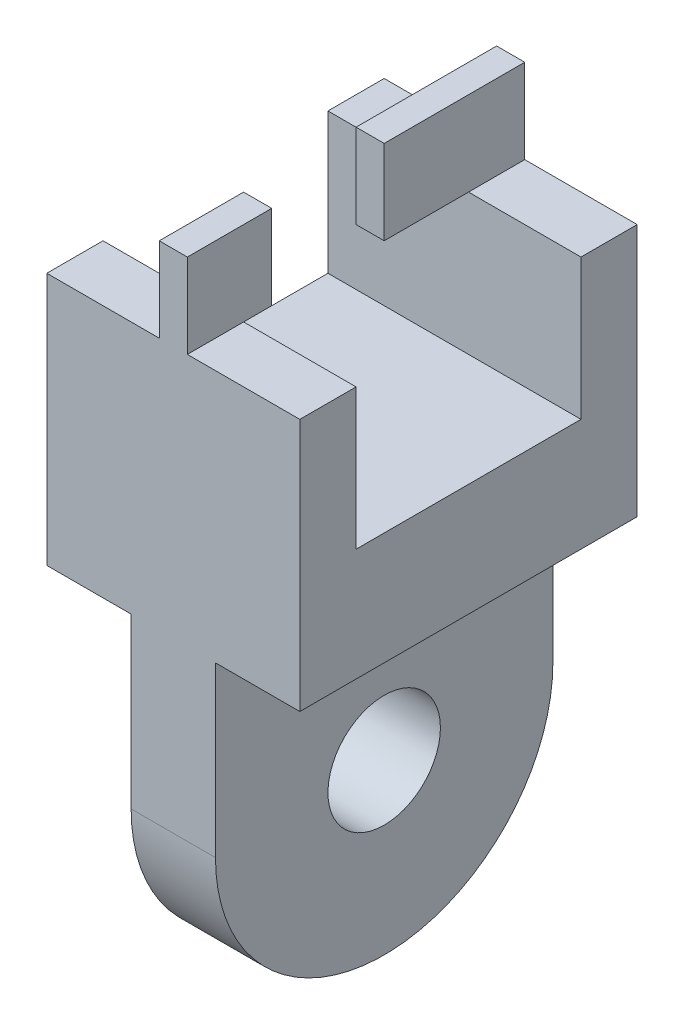
ISO-10303-21;
HEADER;
FILE_DESCRIPTION(('STEP AP214'),'2;1');
FILE_NAME('part.step','',(''),(''),'','','');
FILE_SCHEMA(('AUTOMOTIVE_DESIGN { 1 0 10303 214 1 1 1 1 }'));
ENDSEC;
DATA;
#1=APPLICATION_CONTEXT('core data for automotive mechanical design processes');
#2=APPLICATION_PROTOCOL_DEFINITION('international standard','automotive_design',2000,#1);
#3=PRODUCT_CONTEXT('',#1,'mechanical');
#4=PRODUCT('Part','Part','',(#3));
#5=PRODUCT_RELATED_PRODUCT_CATEGORY('part','',(#4));
#6=PRODUCT_DEFINITION_FORMATION('','',#4);
#7=PRODUCT_DEFINITION_CONTEXT('part definition',#1,'design');
#8=PRODUCT_DEFINITION('design','',#6,#7);
#9=PRODUCT_DEFINITION_SHAPE('','',#8);
#10=(LENGTH_UNIT() NAMED_UNIT(*) SI_UNIT(.MILLI.,.METRE.));
#11=(NAMED_UNIT(*) PLANE_ANGLE_UNIT() SI_UNIT($,.RADIAN.));
#12=(NAMED_UNIT(*) SI_UNIT($,.STERADIAN.) SOLID_ANGLE_UNIT());
#13=UNCERTAINTY_MEASURE_WITH_UNIT(LENGTH_MEASURE(1.E-05),#10,'distance_accuracy_value','');
#14=(GEOMETRIC_REPRESENTATION_CONTEXT(3) GLOBAL_UNCERTAINTY_ASSIGNED_CONTEXT((#13)) GLOBAL_UNIT_ASSIGNED_CONTEXT((#10,
#11,#12)) REPRESENTATION_CONTEXT('',''));
#15=CARTESIAN_POINT('',(0.,0.,0.));
#16=DIRECTION('',(0.,0.,1.));
#17=DIRECTION('',(1.,0.,0.));
#18=AXIS2_PLACEMENT_3D('',#15,#16,#17);
#19=CARTESIAN_POINT('',(112.5,0.,0.));
#20=DIRECTION('',(1.,0.,0.));
#21=DIRECTION('',(0.,0.,-1.));
#22=AXIS2_PLACEMENT_3D('',#19,#20,#21);
#23=PLANE('',#22);
#24=DIRECTION('',(0.,0.,1.));
#25=VECTOR('',#24,1.);
#26=CARTESIAN_POINT('',(112.5,375.,-150.));
#27=LINE('',#26,#25);
#28=CARTESIAN_POINT('',(112.5,375.,100.));
#29=VERTEX_POINT('',#28);
#30=CARTESIAN_POINT('',(112.5,375.,150.));
#31=VERTEX_POINT('',#30);
#32=EDGE_CURVE('E292',#29,#31,#27,.T.);
#33=ORIENTED_EDGE('',*,*,#32,.T.);
#34=DIRECTION('',(0.,1.,0.));
#35=VECTOR('',#34,1.);
#36=CARTESIAN_POINT('',(112.5,0.,150.));
#37=LINE('',#36,#35);
#38=CARTESIAN_POINT('',(112.5,150.,150.));
#39=VERTEX_POINT('',#38);
#40=EDGE_CURVE('E356',#39,#31,#37,.T.);
#41=ORIENTED_EDGE('',*,*,#40,.F.);
#42=DIRECTION('',(0.,0.,1.));
#43=VECTOR('',#42,1.);
#44=CARTESIAN_POINT('',(112.5,150.,-150.));
#45=LINE('',#44,#43);
#46=CARTESIAN_POINT('',(112.5,150.,-150.));
#47=VERTEX_POINT('',#46);
#48=EDGE_CURVE('E312',#47,#39,#45,.T.);
#49=ORIENTED_EDGE('',*,*,#48,.F.);
#50=DIRECTION('',(0.,-1.,0.));
#51=VECTOR('',#50,1.);
#52=CARTESIAN_POINT('',(112.5,450.,-150.));
#53=LINE('',#52,#51);
#54=CARTESIAN_POINT('',(112.5,375.,-150.));
#55=VERTEX_POINT('',#54);
#56=EDGE_CURVE('E353',#55,#47,#53,.T.);
#57=ORIENTED_EDGE('',*,*,#56,.F.);
#58=CARTESIAN_POINT('',(112.5,375.,-100.));
#59=VERTEX_POINT('',#58);
#60=EDGE_CURVE('E288',#55,#59,#27,.T.);
#61=ORIENTED_EDGE('',*,*,#60,.T.);
#62=DIRECTION('',(0.,1.,0.));
#63=VECTOR('',#62,1.);
#64=CARTESIAN_POINT('',(112.5,250.,-100.));
#65=LINE('',#64,#63);
#66=CARTESIAN_POINT('',(112.5,250.,-100.));
#67=VERTEX_POINT('',#66);
#68=EDGE_CURVE('E365',#67,#59,#65,.T.);
#69=ORIENTED_EDGE('',*,*,#68,.F.);
#70=DIRECTION('',(0.,0.,-1.));
#71=VECTOR('',#70,1.);
#72=CARTESIAN_POINT('',(112.5,250.,100.));
#73=LINE('',#72,#71);
#74=CARTESIAN_POINT('',(112.5,250.,100.));
#75=VERTEX_POINT('',#74);
#76=EDGE_CURVE('E362',#75,#67,#73,.T.);
#77=ORIENTED_EDGE('',*,*,#76,.F.);
#78=DIRECTION('',(0.,-1.,0.));
#79=VECTOR('',#78,1.);
#80=CARTESIAN_POINT('',(112.5,375.,100.));
#81=LINE('',#80,#79);
#82=EDGE_CURVE('E359',#29,#75,#81,.T.);
#83=ORIENTED_EDGE('',*,*,#82,.F.);
#84=EDGE_LOOP('',(#33,#41,#49,#57,#61,#69,#77,#83));
#85=FACE_BOUND('',#84,.T.);
#86=ADVANCED_FACE('F82',(#85),#23,.T.);
#87=CARTESIAN_POINT('',(112.5,450.,-24.9999999999999));
#88=DIRECTION('',(0.,1.,0.));
#89=DIRECTION('',(0.,0.,1.));
#90=AXIS2_PLACEMENT_3D('',#87,#88,#89);
#91=PLANE('',#90);
#92=DIRECTION('',(0.,0.,1.));
#93=VECTOR('',#92,1.);
#94=CARTESIAN_POINT('',(12.5,450.,-150.));
#95=LINE('',#94,#93);
#96=CARTESIAN_POINT('',(12.5,450.,-150.));
#97=VERTEX_POINT('',#96);
#98=CARTESIAN_POINT('',(12.5,450.,-24.9999999999999));
#99=VERTEX_POINT('',#98);
#100=EDGE_CURVE('E296',#97,#99,#95,.T.);
#101=ORIENTED_EDGE('',*,*,#100,.F.);
#102=DIRECTION('',(-1.,0.,0.));
#103=VECTOR('',#102,1.);
#104=CARTESIAN_POINT('',(112.5,450.,-150.));
#105=LINE('',#104,#103);
#106=CARTESIAN_POINT('',(-12.5,450.,-150.));
#107=VERTEX_POINT('',#106);
#108=EDGE_CURVE('E368',#97,#107,#105,.T.);
#109=ORIENTED_EDGE('',*,*,#108,.T.);
#110=DIRECTION('',(0.,0.,1.));
#111=VECTOR('',#110,1.);
#112=CARTESIAN_POINT('',(-12.5,450.,-150.));
#113=LINE('',#112,#111);
#114=CARTESIAN_POINT('',(-12.5,450.,-24.9999999999999));
#115=VERTEX_POINT('',#114);
#116=EDGE_CURVE('E268',#107,#115,#113,.T.);
#117=ORIENTED_EDGE('',*,*,#116,.T.);
#118=DIRECTION('',(-1.,0.,0.));
#119=VECTOR('',#118,1.);
#120=CARTESIAN_POINT('',(112.5,450.,-24.9999999999999));
#121=LINE('',#120,#119);
#122=EDGE_CURVE('E91',#99,#115,#121,.T.);
#123=ORIENTED_EDGE('',*,*,#122,.F.);
#124=EDGE_LOOP('',(#101,#109,#117,#123));
#125=FACE_BOUND('',#124,.T.);
#126=ADVANCED_FACE('F84',(#125),#91,.T.);
#127=CARTESIAN_POINT('',(112.5,375.,-24.9999999999999));
#128=DIRECTION('',(0.,0.,1.));
#129=DIRECTION('',(0.,-1.,0.));
#130=AXIS2_PLACEMENT_3D('',#127,#128,#129);
#131=PLANE('',#130);
#132=DIRECTION('',(0.,-1.,0.));
#133=VECTOR('',#132,1.);
#134=CARTESIAN_POINT('',(12.5,375.,-24.9999999999999));
#135=LINE('',#134,#133);
#136=CARTESIAN_POINT('',(12.5,375.,-24.9999999999999));
#137=VERTEX_POINT('',#136);
#138=EDGE_CURVE('E338',#99,#137,#135,.T.);
#139=ORIENTED_EDGE('',*,*,#138,.F.);
#140=ORIENTED_EDGE('',*,*,#122,.T.);
#141=DIRECTION('',(0.,-1.,0.));
#142=VECTOR('',#141,1.);
#143=CARTESIAN_POINT('',(-12.5,375.,-24.9999999999999));
#144=LINE('',#143,#142);
#145=CARTESIAN_POINT('',(-12.5,375.,-24.9999999999999));
#146=VERTEX_POINT('',#145);
#147=EDGE_CURVE('E333',#115,#146,#144,.T.);
#148=ORIENTED_EDGE('',*,*,#147,.T.);
#149=DIRECTION('',(-1.,0.,0.));
#150=VECTOR('',#149,1.);
#151=CARTESIAN_POINT('',(112.5,375.,-24.9999999999999));
#152=LINE('',#151,#150);
#153=EDGE_CURVE('E371',#137,#146,#152,.T.);
#154=ORIENTED_EDGE('',*,*,#153,.F.);
#155=EDGE_LOOP('',(#139,#140,#148,#154));
#156=FACE_BOUND('',#155,.T.);
#157=ADVANCED_FACE('F485',(#156),#131,.T.);
#158=CARTESIAN_POINT('',(112.5,375.,-100.));
#159=DIRECTION('',(0.,-1.,0.));
#160=DIRECTION('',(0.,0.,-1.));
#161=AXIS2_PLACEMENT_3D('',#158,#159,#160);
#162=PLANE('',#161);
#163=DIRECTION('',(0.,0.,1.));
#164=VECTOR('',#163,1.);
#165=CARTESIAN_POINT('',(12.5,375.,-150.));
#166=LINE('',#165,#164);
#167=CARTESIAN_POINT('',(12.5,375.,-100.));
#168=VERTEX_POINT('',#167);
#169=EDGE_CURVE('E295',#168,#137,#166,.T.);
#170=ORIENTED_EDGE('',*,*,#169,.T.);
#171=ORIENTED_EDGE('',*,*,#153,.T.);
#172=DIRECTION('',(0.,0.,1.));
#173=VECTOR('',#172,1.);
#174=CARTESIAN_POINT('',(-12.5,375.,-150.));
#175=LINE('',#174,#173);
#176=CARTESIAN_POINT('',(-12.5,375.,-100.));
#177=VERTEX_POINT('',#176);
#178=EDGE_CURVE('E277',#177,#146,#175,.T.);
#179=ORIENTED_EDGE('',*,*,#178,.F.);
#180=DIRECTION('',(-1.,0.,0.));
#181=VECTOR('',#180,1.);
#182=CARTESIAN_POINT('',(112.5,375.,-100.));
#183=LINE('',#182,#181);
#184=EDGE_CURVE('E377',#168,#177,#183,.T.);
#185=ORIENTED_EDGE('',*,*,#184,.F.);
#186=EDGE_LOOP('',(#170,#171,#179,#185));
#187=FACE_BOUND('',#186,.T.);
#188=ADVANCED_FACE('F435',(#187),#162,.T.);
#189=CARTESIAN_POINT('',(112.5,375.,75.));
#190=DIRECTION('',(0.,-1.,0.));
#191=DIRECTION('',(0.,0.,-1.));
#192=AXIS2_PLACEMENT_3D('',#189,#190,#191);
#193=PLANE('',#192);
#194=CARTESIAN_POINT('',(12.5,375.,75.));
#195=VERTEX_POINT('',#194);
#196=CARTESIAN_POINT('',(12.5,375.,100.));
#197=VERTEX_POINT('',#196);
#198=EDGE_CURVE('E459',#195,#197,#166,.T.);
#199=ORIENTED_EDGE('',*,*,#198,.T.);
#200=DIRECTION('',(-1.,0.,0.));
#201=VECTOR('',#200,1.);
#202=CARTESIAN_POINT('',(112.5,375.,100.));
#203=LINE('',#202,#201);
#204=CARTESIAN_POINT('',(-12.5,375.,100.));
#205=VERTEX_POINT('',#204);
#206=EDGE_CURVE('E384',#197,#205,#203,.T.);
#207=ORIENTED_EDGE('',*,*,#206,.T.);
#208=CARTESIAN_POINT('',(-12.5,375.,75.));
#209=VERTEX_POINT('',#208);
#210=EDGE_CURVE('E438',#209,#205,#175,.T.);
#211=ORIENTED_EDGE('',*,*,#210,.F.);
#212=DIRECTION('',(-1.,0.,0.));
#213=VECTOR('',#212,1.);
#214=CARTESIAN_POINT('',(112.5,375.,75.));
#215=LINE('',#214,#213);
#216=EDGE_CURVE('E385',#195,#209,#215,.T.);
#217=ORIENTED_EDGE('',*,*,#216,.F.);
#218=EDGE_LOOP('',(#199,#207,#211,#217));
#219=FACE_BOUND('',#218,.T.);
#220=ADVANCED_FACE('F457',(#219),#193,.T.);
#221=CARTESIAN_POINT('',(112.5,450.,75.));
#222=DIRECTION('',(0.,0.,-1.));
#223=DIRECTION('',(0.,1.,0.));
#224=AXIS2_PLACEMENT_3D('',#221,#222,#223);
#225=PLANE('',#224);
#226=DIRECTION('',(0.,1.,0.));
#227=VECTOR('',#226,1.);
#228=CARTESIAN_POINT('',(12.5,450.,75.));
#229=LINE('',#228,#227);
#230=CARTESIAN_POINT('',(12.5,450.,75.));
#231=VERTEX_POINT('',#230);
#232=EDGE_CURVE('E336',#195,#231,#229,.T.);
#233=ORIENTED_EDGE('',*,*,#232,.F.);
#234=ORIENTED_EDGE('',*,*,#216,.T.);
#235=DIRECTION('',(0.,1.,0.));
#236=VECTOR('',#235,1.);
#237=CARTESIAN_POINT('',(-12.5,450.,75.));
#238=LINE('',#237,#236);
#239=CARTESIAN_POINT('',(-12.5,450.,75.));
#240=VERTEX_POINT('',#239);
#241=EDGE_CURVE('E330',#209,#240,#238,.T.);
#242=ORIENTED_EDGE('',*,*,#241,.T.);
#243=DIRECTION('',(-1.,0.,0.));
#244=VECTOR('',#243,1.);
#245=CARTESIAN_POINT('',(112.5,450.,75.));
#246=LINE('',#245,#244);
#247=EDGE_CURVE('E388',#231,#240,#246,.T.);
#248=ORIENTED_EDGE('',*,*,#247,.F.);
#249=EDGE_LOOP('',(#233,#234,#242,#248));
#250=FACE_BOUND('',#249,.T.);
#251=ADVANCED_FACE('F453',(#250),#225,.T.);
#252=CARTESIAN_POINT('',(112.5,450.,150.));
#253=DIRECTION('',(0.,1.,0.));
#254=DIRECTION('',(0.,0.,1.));
#255=AXIS2_PLACEMENT_3D('',#252,#253,#254);
#256=PLANE('',#255);
#257=CARTESIAN_POINT('',(12.5,450.,150.));
#258=VERTEX_POINT('',#257);
#259=EDGE_CURVE('E99',#231,#258,#95,.T.);
#260=ORIENTED_EDGE('',*,*,#259,.F.);
#261=ORIENTED_EDGE('',*,*,#247,.T.);
#262=CARTESIAN_POINT('',(-12.5,450.,150.));
#263=VERTEX_POINT('',#262);
#264=EDGE_CURVE('E272',#240,#263,#113,.T.);
#265=ORIENTED_EDGE('',*,*,#264,.T.);
#266=DIRECTION('',(-1.,0.,0.));
#267=VECTOR('',#266,1.);
#268=CARTESIAN_POINT('',(112.5,450.,150.));
#269=LINE('',#268,#267);
#270=EDGE_CURVE('E391',#258,#263,#269,.T.);
#271=ORIENTED_EDGE('',*,*,#270,.F.);
#272=EDGE_LOOP('',(#260,#261,#265,#271));
#273=FACE_BOUND('',#272,.T.);
#274=ADVANCED_FACE('F449',(#273),#256,.T.);
#275=CARTESIAN_POINT('',(112.5,0.,150.));
#276=DIRECTION('',(0.,0.,1.));
#277=DIRECTION('',(1.,0.,0.));
#278=AXIS2_PLACEMENT_3D('',#275,#276,#277);
#279=PLANE('',#278);
#280=DIRECTION('',(1.,0.,0.));
#281=VECTOR('',#280,1.);
#282=CARTESIAN_POINT('',(12.5,375.,150.));
#283=LINE('',#282,#281);
#284=CARTESIAN_POINT('',(12.5,375.,150.));
#285=VERTEX_POINT('',#284);
#286=EDGE_CURVE('E301',#285,#31,#283,.T.);
#287=ORIENTED_EDGE('',*,*,#286,.F.);
#288=DIRECTION('',(0.,-1.,0.));
#289=VECTOR('',#288,1.);
#290=CARTESIAN_POINT('',(12.5,450.,150.));
#291=LINE('',#290,#289);
#292=EDGE_CURVE('E299',#258,#285,#291,.T.);
#293=ORIENTED_EDGE('',*,*,#292,.F.);
#294=ORIENTED_EDGE('',*,*,#270,.T.);
#295=DIRECTION('',(0.,-1.,0.));
#296=VECTOR('',#295,1.);
#297=CARTESIAN_POINT('',(-12.5,450.,150.));
#298=LINE('',#297,#296);
#299=CARTESIAN_POINT('',(-12.5,375.,150.));
#300=VERTEX_POINT('',#299);
#301=EDGE_CURVE('E282',#263,#300,#298,.T.);
#302=ORIENTED_EDGE('',*,*,#301,.T.);
#303=DIRECTION('',(-1.,0.,0.));
#304=VECTOR('',#303,1.);
#305=CARTESIAN_POINT('',(-12.5,375.,150.));
#306=LINE('',#305,#304);
#307=CARTESIAN_POINT('',(-112.5,375.,150.));
#308=VERTEX_POINT('',#307);
#309=EDGE_CURVE('E280',#300,#308,#306,.T.);
#310=ORIENTED_EDGE('',*,*,#309,.T.);
#311=DIRECTION('',(0.,1.,0.));
#312=VECTOR('',#311,1.);
#313=CARTESIAN_POINT('',(-112.5,0.,150.));
#314=LINE('',#313,#312);
#315=CARTESIAN_POINT('',(-112.5,150.,150.));
#316=VERTEX_POINT('',#315);
#317=EDGE_CURVE('E261',#316,#308,#314,.T.);
#318=ORIENTED_EDGE('',*,*,#317,.F.);
#319=DIRECTION('',(1.,0.,0.));
#320=VECTOR('',#319,1.);
#321=CARTESIAN_POINT('',(-112.5,150.,150.));
#322=LINE('',#321,#320);
#323=CARTESIAN_POINT('',(-37.5,150.,150.));
#324=VERTEX_POINT('',#323);
#325=EDGE_CURVE('E238',#316,#324,#322,.T.);
#326=ORIENTED_EDGE('',*,*,#325,.T.);
#327=DIRECTION('',(0.,-1.,0.));
#328=VECTOR('',#327,1.);
#329=CARTESIAN_POINT('',(-37.5,150.,150.));
#330=LINE('',#329,#328);
#331=CARTESIAN_POINT('',(-37.5,0.,150.));
#332=VERTEX_POINT('',#331);
#333=EDGE_CURVE('E248',#324,#332,#330,.T.);
#334=ORIENTED_EDGE('',*,*,#333,.T.);
#335=DIRECTION('',(-1.,0.,0.));
#336=VECTOR('',#335,1.);
#337=CARTESIAN_POINT('',(112.5,0.,150.));
#338=LINE('',#337,#336);
#339=CARTESIAN_POINT('',(37.5,0.,150.));
#340=VERTEX_POINT('',#339);
#341=EDGE_CURVE('E394',#340,#332,#338,.T.);
#342=ORIENTED_EDGE('',*,*,#341,.F.);
#343=DIRECTION('',(0.,1.,0.));
#344=VECTOR('',#343,1.);
#345=CARTESIAN_POINT('',(37.5,-150.,150.));
#346=LINE('',#345,#344);
#347=CARTESIAN_POINT('',(37.5,150.,150.));
#348=VERTEX_POINT('',#347);
#349=EDGE_CURVE('E309',#340,#348,#346,.T.);
#350=ORIENTED_EDGE('',*,*,#349,.T.);
#351=DIRECTION('',(1.,0.,0.));
#352=VECTOR('',#351,1.);
#353=CARTESIAN_POINT('',(37.5,150.,150.));
#354=LINE('',#353,#352);
#355=EDGE_CURVE('E254',#348,#39,#354,.T.);
#356=ORIENTED_EDGE('',*,*,#355,.T.);
#357=ORIENTED_EDGE('',*,*,#40,.T.);
#358=EDGE_LOOP('',(#287,#293,#294,#302,#310,#318,#326,#334,#342,#350,#356,#357));
#359=FACE_BOUND('',#358,.T.);
#360=ADVANCED_FACE('F258',(#359),#279,.T.);
#361=CARTESIAN_POINT('',(112.5,0.,0.));
#362=DIRECTION('',(-1.,0.,0.));
#363=DIRECTION('',(0.,0.,1.));
#364=AXIS2_PLACEMENT_3D('',#361,#362,#363);
#365=CYLINDRICAL_SURFACE('',#364,150.);
#366=CARTESIAN_POINT('',(-37.5,0.,0.));
#367=DIRECTION('',(-1.,0.,0.));
#368=DIRECTION('',(0.,-1.,0.));
#369=AXIS2_PLACEMENT_3D('',#366,#367,#368);
#370=CIRCLE('',#369,150.);
#371=CARTESIAN_POINT('',(-37.5,0.,-150.));
#372=VERTEX_POINT('',#371);
#373=EDGE_CURVE('E250',#372,#332,#370,.T.);
#374=ORIENTED_EDGE('',*,*,#373,.F.);
#375=DIRECTION('',(-1.,0.,0.));
#376=VECTOR('',#375,1.);
#377=CARTESIAN_POINT('',(112.5,0.,-150.));
#378=LINE('',#377,#376);
#379=CARTESIAN_POINT('',(37.5,0.,-150.));
#380=VERTEX_POINT('',#379);
#381=EDGE_CURVE('E396',#380,#372,#378,.T.);
#382=ORIENTED_EDGE('',*,*,#381,.F.);
#383=CARTESIAN_POINT('',(37.5,0.,0.));
#384=DIRECTION('',(1.,0.,0.));
#385=DIRECTION('',(0.,0.,-1.));
#386=AXIS2_PLACEMENT_3D('',#383,#384,#385);
#387=CIRCLE('',#386,150.);
#388=EDGE_CURVE('E327',#340,#380,#387,.T.);
#389=ORIENTED_EDGE('',*,*,#388,.F.);
#390=ORIENTED_EDGE('',*,*,#341,.T.);
#391=EDGE_LOOP('',(#374,#382,#389,#390));
#392=FACE_BOUND('',#391,.T.);
#393=ADVANCED_FACE('F418',(#392),#365,.T.);
#394=CARTESIAN_POINT('',(112.5,450.,-150.));
#395=DIRECTION('',(0.,0.,-1.));
#396=DIRECTION('',(0.,1.,0.));
#397=AXIS2_PLACEMENT_3D('',#394,#395,#396);
#398=PLANE('',#397);
#399=DIRECTION('',(1.,0.,0.));
#400=VECTOR('',#399,1.);
#401=CARTESIAN_POINT('',(12.5,375.,-150.));
#402=LINE('',#401,#400);
#403=CARTESIAN_POINT('',(12.5,375.,-150.));
#404=VERTEX_POINT('',#403);
#405=EDGE_CURVE('E107',#404,#55,#402,.T.);
#406=ORIENTED_EDGE('',*,*,#405,.T.);
#407=ORIENTED_EDGE('',*,*,#56,.T.);
#408=DIRECTION('',(1.,0.,0.));
#409=VECTOR('',#408,1.);
#410=CARTESIAN_POINT('',(37.5,150.,-150.));
#411=LINE('',#410,#409);
#412=CARTESIAN_POINT('',(37.5,150.,-150.));
#413=VERTEX_POINT('',#412);
#414=EDGE_CURVE('E306',#413,#47,#411,.T.);
#415=ORIENTED_EDGE('',*,*,#414,.F.);
#416=DIRECTION('',(0.,1.,0.));
#417=VECTOR('',#416,1.);
#418=CARTESIAN_POINT('',(37.5,-150.,-150.));
#419=LINE('',#418,#417);
#420=EDGE_CURVE('E308',#380,#413,#419,.T.);
#421=ORIENTED_EDGE('',*,*,#420,.F.);
#422=ORIENTED_EDGE('',*,*,#381,.T.);
#423=DIRECTION('',(0.,-1.,0.));
#424=VECTOR('',#423,1.);
#425=CARTESIAN_POINT('',(-37.5,150.,-150.));
#426=LINE('',#425,#424);
#427=CARTESIAN_POINT('',(-37.5,150.,-150.));
#428=VERTEX_POINT('',#427);
#429=EDGE_CURVE('E262',#428,#372,#426,.T.);
#430=ORIENTED_EDGE('',*,*,#429,.F.);
#431=DIRECTION('',(1.,0.,0.));
#432=VECTOR('',#431,1.);
#433=CARTESIAN_POINT('',(-112.5,150.,-150.));
#434=LINE('',#433,#432);
#435=CARTESIAN_POINT('',(-112.5,150.,-150.));
#436=VERTEX_POINT('',#435);
#437=EDGE_CURVE('E241',#436,#428,#434,.T.);
#438=ORIENTED_EDGE('',*,*,#437,.F.);
#439=DIRECTION('',(0.,-1.,0.));
#440=VECTOR('',#439,1.);
#441=CARTESIAN_POINT('',(-112.5,450.,-150.));
#442=LINE('',#441,#440);
#443=CARTESIAN_POINT('',(-112.5,375.,-150.));
#444=VERTEX_POINT('',#443);
#445=EDGE_CURVE('E340',#444,#436,#442,.T.);
#446=ORIENTED_EDGE('',*,*,#445,.F.);
#447=DIRECTION('',(-1.,0.,0.));
#448=VECTOR('',#447,1.);
#449=CARTESIAN_POINT('',(-12.5,375.,-150.));
#450=LINE('',#449,#448);
#451=CARTESIAN_POINT('',(-12.5,375.,-150.));
#452=VERTEX_POINT('',#451);
#453=EDGE_CURVE('E279',#452,#444,#450,.T.);
#454=ORIENTED_EDGE('',*,*,#453,.F.);
#455=DIRECTION('',(0.,-1.,0.));
#456=VECTOR('',#455,1.);
#457=CARTESIAN_POINT('',(-12.5,450.,-150.));
#458=LINE('',#457,#456);
#459=EDGE_CURVE('E283',#107,#452,#458,.T.);
#460=ORIENTED_EDGE('',*,*,#459,.F.);
#461=ORIENTED_EDGE('',*,*,#108,.F.);
#462=DIRECTION('',(0.,-1.,0.));
#463=VECTOR('',#462,1.);
#464=CARTESIAN_POINT('',(12.5,450.,-150.));
#465=LINE('',#464,#463);
#466=EDGE_CURVE('E298',#97,#404,#465,.T.);
#467=ORIENTED_EDGE('',*,*,#466,.T.);
#468=EDGE_LOOP('',(#406,#407,#415,#421,#422,#430,#438,#446,#454,#460,#461,#467));
#469=FACE_BOUND('',#468,.T.);
#470=ADVANCED_FACE('F417',(#469),#398,.T.);
#471=CARTESIAN_POINT('',(-112.5,0.,0.));
#472=DIRECTION('',(-1.,0.,0.));
#473=DIRECTION('',(0.,0.,-1.));
#474=AXIS2_PLACEMENT_3D('',#471,#472,#473);
#475=PLANE('',#474);
#476=ORIENTED_EDGE('',*,*,#317,.T.);
#477=DIRECTION('',(0.,0.,-1.));
#478=VECTOR('',#477,1.);
#479=CARTESIAN_POINT('',(-112.5,375.,0.));
#480=LINE('',#479,#478);
#481=CARTESIAN_POINT('',(-112.5,375.,100.));
#482=VERTEX_POINT('',#481);
#483=EDGE_CURVE('E12',#308,#482,#480,.T.);
#484=ORIENTED_EDGE('',*,*,#483,.T.);
#485=DIRECTION('',(0.,-1.,0.));
#486=VECTOR('',#485,1.);
#487=CARTESIAN_POINT('',(-112.5,375.,100.));
#488=LINE('',#487,#486);
#489=CARTESIAN_POINT('',(-112.5,250.,100.));
#490=VERTEX_POINT('',#489);
#491=EDGE_CURVE('E344',#482,#490,#488,.T.);
#492=ORIENTED_EDGE('',*,*,#491,.T.);
#493=DIRECTION('',(0.,0.,-1.));
#494=VECTOR('',#493,1.);
#495=CARTESIAN_POINT('',(-112.5,250.,100.));
#496=LINE('',#495,#494);
#497=CARTESIAN_POINT('',(-112.5,250.,-100.));
#498=VERTEX_POINT('',#497);
#499=EDGE_CURVE('E347',#490,#498,#496,.T.);
#500=ORIENTED_EDGE('',*,*,#499,.T.);
#501=DIRECTION('',(0.,1.,0.));
#502=VECTOR('',#501,1.);
#503=CARTESIAN_POINT('',(-112.5,250.,-100.));
#504=LINE('',#503,#502);
#505=CARTESIAN_POINT('',(-112.5,375.,-100.));
#506=VERTEX_POINT('',#505);
#507=EDGE_CURVE('E350',#498,#506,#504,.T.);
#508=ORIENTED_EDGE('',*,*,#507,.T.);
#509=DIRECTION('',(0.,0.,1.));
#510=VECTOR('',#509,1.);
#511=CARTESIAN_POINT('',(-112.5,375.,-150.));
#512=LINE('',#511,#510);
#513=EDGE_CURVE('E276',#444,#506,#512,.T.);
#514=ORIENTED_EDGE('',*,*,#513,.F.);
#515=ORIENTED_EDGE('',*,*,#445,.T.);
#516=DIRECTION('',(0.,0.,1.));
#517=VECTOR('',#516,1.);
#518=CARTESIAN_POINT('',(-112.5,150.,-150.));
#519=LINE('',#518,#517);
#520=EDGE_CURVE('E245',#436,#316,#519,.T.);
#521=ORIENTED_EDGE('',*,*,#520,.T.);
#522=EDGE_LOOP('',(#476,#484,#492,#500,#508,#514,#515,#521));
#523=FACE_BOUND('',#522,.T.);
#524=ADVANCED_FACE('F423',(#523),#475,.T.);
#525=CARTESIAN_POINT('',(112.5,250.,-100.));
#526=DIRECTION('',(0.,0.,1.));
#527=DIRECTION('',(1.,0.,0.));
#528=AXIS2_PLACEMENT_3D('',#525,#526,#527);
#529=PLANE('',#528);
#530=EDGE_CURVE('E374',#59,#168,#183,.T.);
#531=ORIENTED_EDGE('',*,*,#530,.T.);
#532=ORIENTED_EDGE('',*,*,#184,.T.);
#533=DIRECTION('',(-1.,0.,0.));
#534=VECTOR('',#533,1.);
#535=CARTESIAN_POINT('',(112.5,375.,-100.));
#536=LINE('',#535,#534);
#537=EDGE_CURVE('E323',#177,#506,#536,.T.);
#538=ORIENTED_EDGE('',*,*,#537,.T.);
#539=ORIENTED_EDGE('',*,*,#507,.F.);
#540=DIRECTION('',(-1.,0.,0.));
#541=VECTOR('',#540,1.);
#542=CARTESIAN_POINT('',(112.5,250.,-100.));
#543=LINE('',#542,#541);
#544=EDGE_CURVE('E378',#67,#498,#543,.T.);
#545=ORIENTED_EDGE('',*,*,#544,.F.);
#546=ORIENTED_EDGE('',*,*,#68,.T.);
#547=EDGE_LOOP('',(#531,#532,#538,#539,#545,#546));
#548=FACE_BOUND('',#547,.T.);
#549=ADVANCED_FACE('F430',(#548),#529,.T.);
#550=CARTESIAN_POINT('',(112.5,250.,100.));
#551=DIRECTION('',(0.,1.,0.));
#552=DIRECTION('',(0.,0.,1.));
#553=AXIS2_PLACEMENT_3D('',#550,#551,#552);
#554=PLANE('',#553);
#555=ORIENTED_EDGE('',*,*,#544,.T.);
#556=ORIENTED_EDGE('',*,*,#499,.F.);
#557=DIRECTION('',(-1.,0.,0.));
#558=VECTOR('',#557,1.);
#559=CARTESIAN_POINT('',(112.5,250.,100.));
#560=LINE('',#559,#558);
#561=EDGE_CURVE('E380',#75,#490,#560,.T.);
#562=ORIENTED_EDGE('',*,*,#561,.F.);
#563=ORIENTED_EDGE('',*,*,#76,.T.);
#564=EDGE_LOOP('',(#555,#556,#562,#563));
#565=FACE_BOUND('',#564,.T.);
#566=ADVANCED_FACE('F468',(#565),#554,.T.);
#567=CARTESIAN_POINT('',(112.5,375.,100.));
#568=DIRECTION('',(0.,0.,-1.));
#569=DIRECTION('',(-1.,0.,0.));
#570=AXIS2_PLACEMENT_3D('',#567,#568,#569);
#571=PLANE('',#570);
#572=ORIENTED_EDGE('',*,*,#561,.T.);
#573=ORIENTED_EDGE('',*,*,#491,.F.);
#574=DIRECTION('',(1.,0.,0.));
#575=VECTOR('',#574,1.);
#576=CARTESIAN_POINT('',(112.5,375.,100.));
#577=LINE('',#576,#575);
#578=EDGE_CURVE('E319',#482,#205,#577,.T.);
#579=ORIENTED_EDGE('',*,*,#578,.T.);
#580=ORIENTED_EDGE('',*,*,#206,.F.);
#581=EDGE_CURVE('E382',#29,#197,#203,.T.);
#582=ORIENTED_EDGE('',*,*,#581,.F.);
#583=ORIENTED_EDGE('',*,*,#82,.T.);
#584=EDGE_LOOP('',(#572,#573,#579,#580,#582,#583));
#585=FACE_BOUND('',#584,.T.);
#586=ADVANCED_FACE('F463',(#585),#571,.T.);
#587=CARTESIAN_POINT('',(-37.5,150.,-150.));
#588=DIRECTION('',(-1.,0.,0.));
#589=DIRECTION('',(0.,-1.,0.));
#590=AXIS2_PLACEMENT_3D('',#587,#588,#589);
#591=PLANE('',#590);
#592=CARTESIAN_POINT('',(-37.5,0.,0.));
#593=DIRECTION('',(-1.,0.,0.));
#594=DIRECTION('',(0.,-1.,0.));
#595=AXIS2_PLACEMENT_3D('',#592,#593,#594);
#596=CIRCLE('',#595,50.);
#597=CARTESIAN_POINT('',(-37.5,-50.,0.));
#598=VERTEX_POINT('',#597);
#599=EDGE_CURVE('E86',#598,#598,#596,.T.);
#600=ORIENTED_EDGE('',*,*,#599,.F.);
#601=EDGE_LOOP('',(#600));
#602=FACE_BOUND('',#601,.T.);
#603=ORIENTED_EDGE('',*,*,#373,.T.);
#604=ORIENTED_EDGE('',*,*,#333,.F.);
#605=DIRECTION('',(0.,0.,1.));
#606=VECTOR('',#605,1.);
#607=CARTESIAN_POINT('',(-37.5,150.,-150.));
#608=LINE('',#607,#606);
#609=EDGE_CURVE('E234',#428,#324,#608,.T.);
#610=ORIENTED_EDGE('',*,*,#609,.F.);
#611=ORIENTED_EDGE('',*,*,#429,.T.);
#612=EDGE_LOOP('',(#603,#604,#610,#611));
#613=FACE_BOUND('',#612,.T.);
#614=ADVANCED_FACE('F249',(#602,#613),#591,.T.);
#615=CARTESIAN_POINT('',(-112.5,150.,-150.));
#616=DIRECTION('',(0.,-1.,0.));
#617=DIRECTION('',(0.,0.,-1.));
#618=AXIS2_PLACEMENT_3D('',#615,#616,#617);
#619=PLANE('',#618);
#620=ORIENTED_EDGE('',*,*,#325,.F.);
#621=ORIENTED_EDGE('',*,*,#520,.F.);
#622=ORIENTED_EDGE('',*,*,#437,.T.);
#623=ORIENTED_EDGE('',*,*,#609,.T.);
#624=EDGE_LOOP('',(#620,#621,#622,#623));
#625=FACE_BOUND('',#624,.T.);
#626=ADVANCED_FACE('F236',(#625),#619,.T.);
#627=CARTESIAN_POINT('',(-12.5,375.,-150.));
#628=DIRECTION('',(0.,1.,0.));
#629=DIRECTION('',(0.,0.,1.));
#630=AXIS2_PLACEMENT_3D('',#627,#628,#629);
#631=PLANE('',#630);
#632=EDGE_CURVE('E273',#452,#177,#175,.T.);
#633=ORIENTED_EDGE('',*,*,#632,.F.);
#634=ORIENTED_EDGE('',*,*,#453,.T.);
#635=ORIENTED_EDGE('',*,*,#513,.T.);
#636=ORIENTED_EDGE('',*,*,#537,.F.);
#637=EDGE_LOOP('',(#633,#634,#635,#636));
#638=FACE_BOUND('',#637,.T.);
#639=ADVANCED_FACE('F427',(#638),#631,.T.);
#640=CARTESIAN_POINT('',(-12.5,450.,-150.));
#641=DIRECTION('',(-1.,0.,0.));
#642=DIRECTION('',(0.,-1.,0.));
#643=AXIS2_PLACEMENT_3D('',#640,#641,#642);
#644=PLANE('',#643);
#645=ORIENTED_EDGE('',*,*,#116,.F.);
#646=ORIENTED_EDGE('',*,*,#459,.T.);
#647=ORIENTED_EDGE('',*,*,#632,.T.);
#648=ORIENTED_EDGE('',*,*,#178,.T.);
#649=ORIENTED_EDGE('',*,*,#147,.F.);
#650=EDGE_LOOP('',(#645,#646,#647,#648,#649));
#651=FACE_BOUND('',#650,.T.);
#652=ADVANCED_FACE('F566',(#651),#644,.T.);
#653=ORIENTED_EDGE('',*,*,#210,.T.);
#654=EDGE_CURVE('E271',#205,#300,#175,.T.);
#655=ORIENTED_EDGE('',*,*,#654,.T.);
#656=ORIENTED_EDGE('',*,*,#301,.F.);
#657=ORIENTED_EDGE('',*,*,#264,.F.);
#658=ORIENTED_EDGE('',*,*,#241,.F.);
#659=EDGE_LOOP('',(#653,#655,#656,#657,#658));
#660=FACE_BOUND('',#659,.T.);
#661=ADVANCED_FACE('F443',(#660),#644,.T.);
#662=ORIENTED_EDGE('',*,*,#483,.F.);
#663=ORIENTED_EDGE('',*,*,#309,.F.);
#664=ORIENTED_EDGE('',*,*,#654,.F.);
#665=ORIENTED_EDGE('',*,*,#578,.F.);
#666=EDGE_LOOP('',(#662,#663,#664,#665));
#667=FACE_BOUND('',#666,.T.);
#668=ADVANCED_FACE('F446',(#667),#631,.T.);
#669=CARTESIAN_POINT('',(112.5,0.,0.));
#670=DIRECTION('',(-1.,0.,0.));
#671=DIRECTION('',(0.,0.,1.));
#672=AXIS2_PLACEMENT_3D('',#669,#670,#671);
#673=CYLINDRICAL_SURFACE('',#672,50.);
#674=CARTESIAN_POINT('',(37.5,0.,0.));
#675=DIRECTION('',(1.,0.,0.));
#676=DIRECTION('',(0.,0.,-1.));
#677=AXIS2_PLACEMENT_3D('',#674,#675,#676);
#678=CIRCLE('',#677,50.);
#679=CARTESIAN_POINT('',(37.5,0.,-50.));
#680=VERTEX_POINT('',#679);
#681=EDGE_CURVE('E326',#680,#680,#678,.T.);
#682=ORIENTED_EDGE('',*,*,#681,.T.);
#683=EDGE_LOOP('',(#682));
#684=FACE_BOUND('',#683,.T.);
#685=ORIENTED_EDGE('',*,*,#599,.T.);
#686=EDGE_LOOP('',(#685));
#687=FACE_BOUND('',#686,.T.);
#688=ADVANCED_FACE('F403',(#684,#687),#673,.F.);
#689=CARTESIAN_POINT('',(37.5,-150.,-150.));
#690=DIRECTION('',(1.,0.,0.));
#691=DIRECTION('',(0.,0.,-1.));
#692=AXIS2_PLACEMENT_3D('',#689,#690,#691);
#693=PLANE('',#692);
#694=ORIENTED_EDGE('',*,*,#681,.F.);
#695=EDGE_LOOP('',(#694));
#696=FACE_BOUND('',#695,.T.);
#697=ORIENTED_EDGE('',*,*,#388,.T.);
#698=ORIENTED_EDGE('',*,*,#420,.T.);
#699=DIRECTION('',(0.,0.,1.));
#700=VECTOR('',#699,1.);
#701=CARTESIAN_POINT('',(37.5,150.,-150.));
#702=LINE('',#701,#700);
#703=EDGE_CURVE('E317',#413,#348,#702,.T.);
#704=ORIENTED_EDGE('',*,*,#703,.T.);
#705=ORIENTED_EDGE('',*,*,#349,.F.);
#706=EDGE_LOOP('',(#697,#698,#704,#705));
#707=FACE_BOUND('',#706,.T.);
#708=ADVANCED_FACE('F406',(#696,#707),#693,.T.);
#709=CARTESIAN_POINT('',(37.5,150.,-150.));
#710=DIRECTION('',(0.,-1.,0.));
#711=DIRECTION('',(0.,0.,-1.));
#712=AXIS2_PLACEMENT_3D('',#709,#710,#711);
#713=PLANE('',#712);
#714=ORIENTED_EDGE('',*,*,#355,.F.);
#715=ORIENTED_EDGE('',*,*,#703,.F.);
#716=ORIENTED_EDGE('',*,*,#414,.T.);
#717=ORIENTED_EDGE('',*,*,#48,.T.);
#718=EDGE_LOOP('',(#714,#715,#716,#717));
#719=FACE_BOUND('',#718,.T.);
#720=ADVANCED_FACE('F409',(#719),#713,.T.);
#721=CARTESIAN_POINT('',(12.5,450.,-150.));
#722=DIRECTION('',(-1.,0.,0.));
#723=DIRECTION('',(0.,-1.,0.));
#724=AXIS2_PLACEMENT_3D('',#721,#722,#723);
#725=PLANE('',#724);
#726=ORIENTED_EDGE('',*,*,#138,.T.);
#727=ORIENTED_EDGE('',*,*,#169,.F.);
#728=EDGE_CURVE('E293',#404,#168,#166,.T.);
#729=ORIENTED_EDGE('',*,*,#728,.F.);
#730=ORIENTED_EDGE('',*,*,#466,.F.);
#731=ORIENTED_EDGE('',*,*,#100,.T.);
#732=EDGE_LOOP('',(#726,#727,#729,#730,#731));
#733=FACE_BOUND('',#732,.T.);
#734=ADVANCED_FACE('F480',(#733),#725,.F.);
#735=CARTESIAN_POINT('',(12.5,375.,-150.));
#736=DIRECTION('',(0.,-1.,0.));
#737=DIRECTION('',(0.,0.,-1.));
#738=AXIS2_PLACEMENT_3D('',#735,#736,#737);
#739=PLANE('',#738);
#740=ORIENTED_EDGE('',*,*,#530,.F.);
#741=ORIENTED_EDGE('',*,*,#60,.F.);
#742=ORIENTED_EDGE('',*,*,#405,.F.);
#743=ORIENTED_EDGE('',*,*,#728,.T.);
#744=EDGE_LOOP('',(#740,#741,#742,#743));
#745=FACE_BOUND('',#744,.T.);
#746=ADVANCED_FACE('F475',(#745),#739,.F.);
#747=ORIENTED_EDGE('',*,*,#581,.T.);
#748=EDGE_CURVE('E291',#197,#285,#166,.T.);
#749=ORIENTED_EDGE('',*,*,#748,.T.);
#750=ORIENTED_EDGE('',*,*,#286,.T.);
#751=ORIENTED_EDGE('',*,*,#32,.F.);
#752=EDGE_LOOP('',(#747,#749,#750,#751));
#753=FACE_BOUND('',#752,.T.);
#754=ADVANCED_FACE('F488',(#753),#739,.F.);
#755=ORIENTED_EDGE('',*,*,#232,.T.);
#756=ORIENTED_EDGE('',*,*,#259,.T.);
#757=ORIENTED_EDGE('',*,*,#292,.T.);
#758=ORIENTED_EDGE('',*,*,#748,.F.);
#759=ORIENTED_EDGE('',*,*,#198,.F.);
#760=EDGE_LOOP('',(#755,#756,#757,#758,#759));
#761=FACE_BOUND('',#760,.T.);
#762=ADVANCED_FACE('F489',(#761),#725,.F.);
#763=CLOSED_SHELL('',(#86,#126,#157,#188,#220,#251,#274,#360,#393,#470,#524,#549,#566,#586,#614,
#626,#639,#652,#661,#668,#688,#708,#720,#734,#746,#754,#762));
#764=MANIFOLD_SOLID_BREP('B2',#763);
#765=ADVANCED_BREP_SHAPE_REPRESENTATION('',(#18,#764),#14);
#766=SHAPE_DEFINITION_REPRESENTATION(#9,#765);
ENDSEC;
END-ISO-10303-21;
